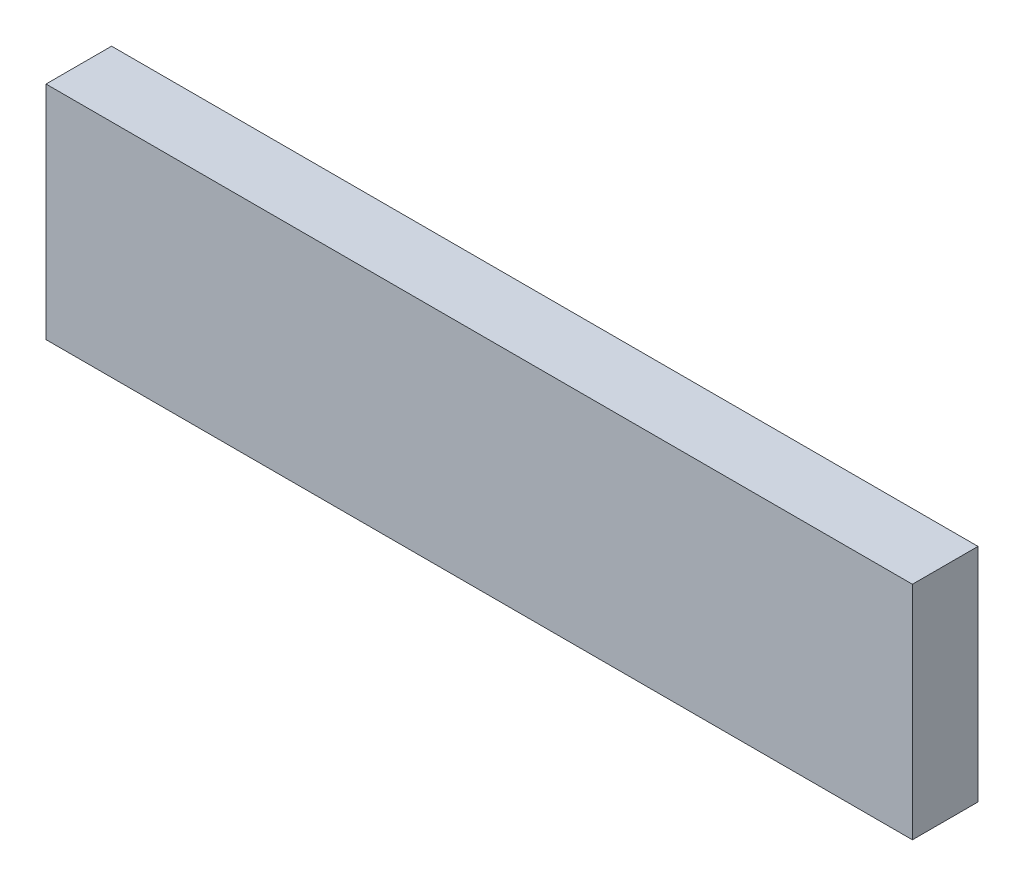
ISO-10303-21;
HEADER;
FILE_DESCRIPTION(('STEP AP214'),'2;1');
FILE_NAME('part.step','',(''),(''),'','','');
FILE_SCHEMA(('AUTOMOTIVE_DESIGN { 1 0 10303 214 1 1 1 1 }'));
ENDSEC;
DATA;
#1=APPLICATION_CONTEXT('core data for automotive mechanical design processes');
#2=APPLICATION_PROTOCOL_DEFINITION('international standard','automotive_design',2000,#1);
#3=PRODUCT_CONTEXT('',#1,'mechanical');
#4=PRODUCT('Part','Part','',(#3));
#5=PRODUCT_RELATED_PRODUCT_CATEGORY('part','',(#4));
#6=PRODUCT_DEFINITION_FORMATION('','',#4);
#7=PRODUCT_DEFINITION_CONTEXT('part definition',#1,'design');
#8=PRODUCT_DEFINITION('design','',#6,#7);
#9=PRODUCT_DEFINITION_SHAPE('','',#8);
#10=(LENGTH_UNIT() NAMED_UNIT(*) SI_UNIT(.MILLI.,.METRE.));
#11=(NAMED_UNIT(*) PLANE_ANGLE_UNIT() SI_UNIT($,.RADIAN.));
#12=(NAMED_UNIT(*) SI_UNIT($,.STERADIAN.) SOLID_ANGLE_UNIT());
#13=UNCERTAINTY_MEASURE_WITH_UNIT(LENGTH_MEASURE(1.E-05),#10,'distance_accuracy_value','');
#14=(GEOMETRIC_REPRESENTATION_CONTEXT(3) GLOBAL_UNCERTAINTY_ASSIGNED_CONTEXT((#13)) GLOBAL_UNIT_ASSIGNED_CONTEXT((#10,
#11,#12)) REPRESENTATION_CONTEXT('',''));
#15=CARTESIAN_POINT('',(0.,0.,0.));
#16=DIRECTION('',(0.,0.,1.));
#17=DIRECTION('',(1.,0.,0.));
#18=AXIS2_PLACEMENT_3D('',#15,#16,#17);
#19=CARTESIAN_POINT('',(258.902458050723,35.3959813156576,62.8606367334853));
#20=DIRECTION('',(1.,0.,0.));
#21=DIRECTION('',(0.,0.,-1.));
#22=AXIS2_PLACEMENT_3D('',#19,#20,#21);
#23=PLANE('',#22);
#24=DIRECTION('',(0.,-1.,0.));
#25=VECTOR('',#24,1.);
#26=CARTESIAN_POINT('',(258.902458050723,35.3959813156576,61.8606367334853));
#27=LINE('',#26,#25);
#28=CARTESIAN_POINT('',(258.902458050723,35.3959813156576,61.8606367334853));
#29=VERTEX_POINT('',#28);
#30=CARTESIAN_POINT('',(258.902458050723,32.0207746909689,61.8606367334853));
#31=VERTEX_POINT('',#30);
#32=EDGE_CURVE('E103',#29,#31,#27,.T.);
#33=ORIENTED_EDGE('',*,*,#32,.T.);
#34=DIRECTION('',(0.,0.,-1.));
#35=VECTOR('',#34,1.);
#36=CARTESIAN_POINT('',(258.902458050723,32.0207746909689,62.8606367334853));
#37=LINE('',#36,#35);
#38=CARTESIAN_POINT('',(258.902458050723,32.0207746909689,62.8606367334853));
#39=VERTEX_POINT('',#38);
#40=EDGE_CURVE('E11',#39,#31,#37,.T.);
#41=ORIENTED_EDGE('',*,*,#40,.F.);
#42=DIRECTION('',(0.,-1.,0.));
#43=VECTOR('',#42,1.);
#44=CARTESIAN_POINT('',(258.902458050723,35.3959813156576,62.8606367334853));
#45=LINE('',#44,#43);
#46=CARTESIAN_POINT('',(258.902458050723,35.3959813156576,62.8606367334853));
#47=VERTEX_POINT('',#46);
#48=EDGE_CURVE('E91',#47,#39,#45,.T.);
#49=ORIENTED_EDGE('',*,*,#48,.F.);
#50=DIRECTION('',(0.,0.,-1.));
#51=VECTOR('',#50,1.);
#52=CARTESIAN_POINT('',(258.902458050723,35.3959813156576,62.8606367334853));
#53=LINE('',#52,#51);
#54=EDGE_CURVE('E99',#47,#29,#53,.T.);
#55=ORIENTED_EDGE('',*,*,#54,.T.);
#56=EDGE_LOOP('',(#33,#41,#49,#55));
#57=FACE_BOUND('',#56,.T.);
#58=ADVANCED_FACE('F40',(#57),#23,.F.);
#59=CARTESIAN_POINT('',(258.902458050723,32.0207746909689,62.8606367334853));
#60=DIRECTION('',(0.,1.,0.));
#61=DIRECTION('',(0.,0.,1.));
#62=AXIS2_PLACEMENT_3D('',#59,#60,#61);
#63=PLANE('',#62);
#64=DIRECTION('',(1.,0.,0.));
#65=VECTOR('',#64,1.);
#66=CARTESIAN_POINT('',(258.902458050723,32.0207746909689,61.8606367334853));
#67=LINE('',#66,#65);
#68=CARTESIAN_POINT('',(272.113265494775,32.0207746909689,61.8606367334853));
#69=VERTEX_POINT('',#68);
#70=EDGE_CURVE('E95',#31,#69,#67,.T.);
#71=ORIENTED_EDGE('',*,*,#70,.T.);
#72=DIRECTION('',(0.,0.,-1.));
#73=VECTOR('',#72,1.);
#74=CARTESIAN_POINT('',(272.113265494775,32.0207746909689,62.8606367334853));
#75=LINE('',#74,#73);
#76=CARTESIAN_POINT('',(272.113265494775,32.0207746909689,62.8606367334853));
#77=VERTEX_POINT('',#76);
#78=EDGE_CURVE('E48',#77,#69,#75,.T.);
#79=ORIENTED_EDGE('',*,*,#78,.F.);
#80=DIRECTION('',(1.,0.,0.));
#81=VECTOR('',#80,1.);
#82=CARTESIAN_POINT('',(258.902458050723,32.0207746909689,62.8606367334853));
#83=LINE('',#82,#81);
#84=EDGE_CURVE('E86',#39,#77,#83,.T.);
#85=ORIENTED_EDGE('',*,*,#84,.F.);
#86=ORIENTED_EDGE('',*,*,#40,.T.);
#87=EDGE_LOOP('',(#71,#79,#85,#86));
#88=FACE_BOUND('',#87,.T.);
#89=ADVANCED_FACE('F94',(#88),#63,.F.);
#90=CARTESIAN_POINT('',(272.113265494775,35.3959813156576,62.8606367334853));
#91=DIRECTION('',(-1.,0.,0.));
#92=DIRECTION('',(0.,0.,1.));
#93=AXIS2_PLACEMENT_3D('',#90,#91,#92);
#94=PLANE('',#93);
#95=DIRECTION('',(0.,1.,0.));
#96=VECTOR('',#95,1.);
#97=CARTESIAN_POINT('',(272.113265494775,35.3959813156576,61.8606367334853));
#98=LINE('',#97,#96);
#99=CARTESIAN_POINT('',(272.113265494775,35.3959813156576,61.8606367334853));
#100=VERTEX_POINT('',#99);
#101=EDGE_CURVE('E73',#69,#100,#98,.T.);
#102=ORIENTED_EDGE('',*,*,#101,.T.);
#103=DIRECTION('',(0.,0.,-1.));
#104=VECTOR('',#103,1.);
#105=CARTESIAN_POINT('',(272.113265494775,35.3959813156576,62.8606367334853));
#106=LINE('',#105,#104);
#107=CARTESIAN_POINT('',(272.113265494775,35.3959813156576,62.8606367334853));
#108=VERTEX_POINT('',#107);
#109=EDGE_CURVE('E96',#108,#100,#106,.T.);
#110=ORIENTED_EDGE('',*,*,#109,.F.);
#111=DIRECTION('',(0.,1.,0.));
#112=VECTOR('',#111,1.);
#113=CARTESIAN_POINT('',(272.113265494775,35.3959813156576,62.8606367334853));
#114=LINE('',#113,#112);
#115=EDGE_CURVE('E89',#77,#108,#114,.T.);
#116=ORIENTED_EDGE('',*,*,#115,.F.);
#117=ORIENTED_EDGE('',*,*,#78,.T.);
#118=EDGE_LOOP('',(#102,#110,#116,#117));
#119=FACE_BOUND('',#118,.T.);
#120=ADVANCED_FACE('F97',(#119),#94,.F.);
#121=CARTESIAN_POINT('',(258.902458050723,35.3959813156576,62.8606367334853));
#122=DIRECTION('',(0.,-1.,0.));
#123=DIRECTION('',(0.,0.,-1.));
#124=AXIS2_PLACEMENT_3D('',#121,#122,#123);
#125=PLANE('',#124);
#126=DIRECTION('',(-1.,0.,0.));
#127=VECTOR('',#126,1.);
#128=CARTESIAN_POINT('',(258.902458050723,35.3959813156576,61.8606367334853));
#129=LINE('',#128,#127);
#130=EDGE_CURVE('E79',#100,#29,#129,.T.);
#131=ORIENTED_EDGE('',*,*,#130,.T.);
#132=ORIENTED_EDGE('',*,*,#54,.F.);
#133=DIRECTION('',(-1.,0.,0.));
#134=VECTOR('',#133,1.);
#135=CARTESIAN_POINT('',(258.902458050723,35.3959813156576,62.8606367334853));
#136=LINE('',#135,#134);
#137=EDGE_CURVE('E56',#108,#47,#136,.T.);
#138=ORIENTED_EDGE('',*,*,#137,.F.);
#139=ORIENTED_EDGE('',*,*,#109,.T.);
#140=EDGE_LOOP('',(#131,#132,#138,#139));
#141=FACE_BOUND('',#140,.T.);
#142=ADVANCED_FACE('F110',(#141),#125,.F.);
#143=CARTESIAN_POINT('',(0.,0.,62.8606367334853));
#144=DIRECTION('',(0.,0.,1.));
#145=DIRECTION('',(1.,0.,0.));
#146=AXIS2_PLACEMENT_3D('',#143,#144,#145);
#147=PLANE('',#146);
#148=ORIENTED_EDGE('',*,*,#48,.T.);
#149=ORIENTED_EDGE('',*,*,#84,.T.);
#150=ORIENTED_EDGE('',*,*,#115,.T.);
#151=ORIENTED_EDGE('',*,*,#137,.T.);
#152=EDGE_LOOP('',(#148,#149,#150,#151));
#153=FACE_BOUND('',#152,.T.);
#154=ADVANCED_FACE('F87',(#153),#147,.T.);
#155=CARTESIAN_POINT('',(0.,0.,61.8606367334853));
#156=DIRECTION('',(0.,0.,1.));
#157=DIRECTION('',(1.,0.,0.));
#158=AXIS2_PLACEMENT_3D('',#155,#156,#157);
#159=PLANE('',#158);
#160=ORIENTED_EDGE('',*,*,#32,.F.);
#161=ORIENTED_EDGE('',*,*,#130,.F.);
#162=ORIENTED_EDGE('',*,*,#101,.F.);
#163=ORIENTED_EDGE('',*,*,#70,.F.);
#164=EDGE_LOOP('',(#160,#161,#162,#163));
#165=FACE_BOUND('',#164,.T.);
#166=ADVANCED_FACE('F113',(#165),#159,.F.);
#167=CLOSED_SHELL('',(#58,#89,#120,#142,#154,#166));
#168=MANIFOLD_SOLID_BREP('B2',#167);
#169=ADVANCED_BREP_SHAPE_REPRESENTATION('',(#18,#168),#14);
#170=SHAPE_DEFINITION_REPRESENTATION(#9,#169);
ENDSEC;
END-ISO-10303-21;
